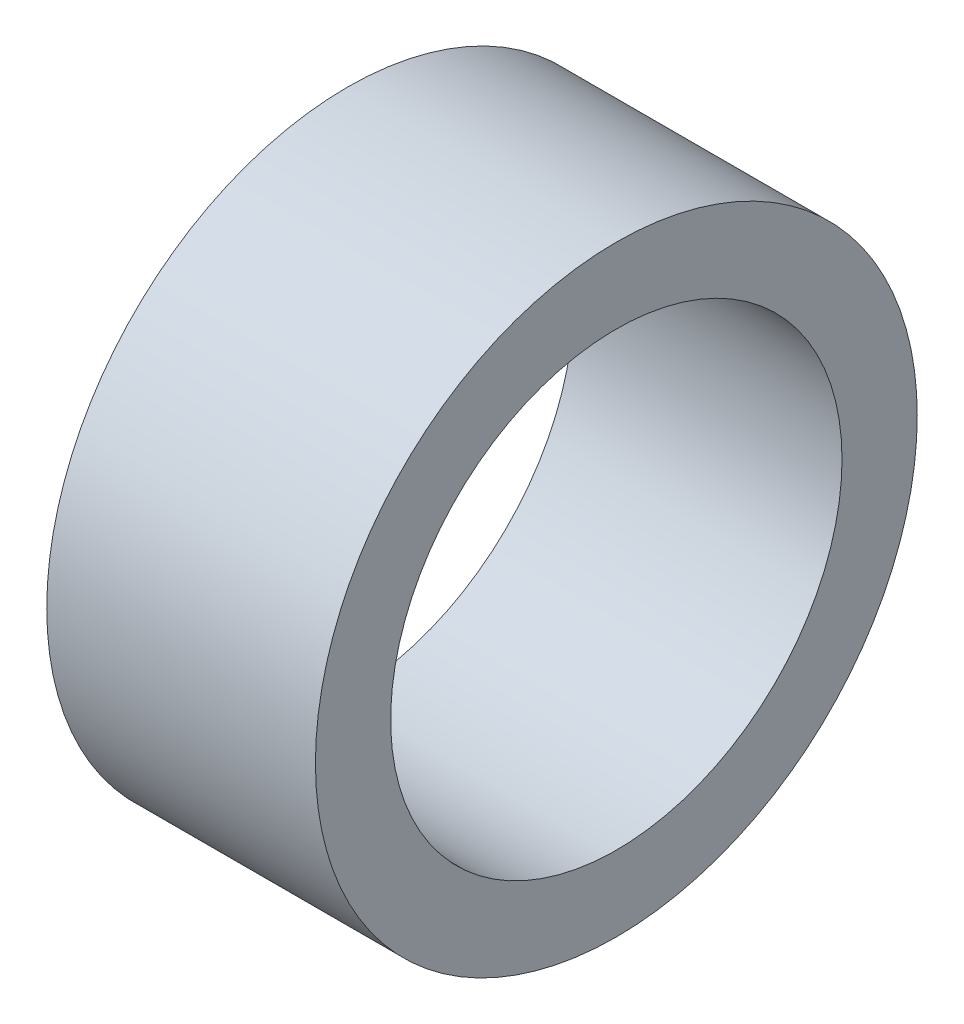
ISO-10303-21;
HEADER;
FILE_DESCRIPTION(('STEP AP214'),'2;1');
FILE_NAME('part.step','',(''),(''),'','','');
FILE_SCHEMA(('AUTOMOTIVE_DESIGN { 1 0 10303 214 1 1 1 1 }'));
ENDSEC;
DATA;
#1=APPLICATION_CONTEXT('core data for automotive mechanical design processes');
#2=APPLICATION_PROTOCOL_DEFINITION('international standard','automotive_design',2000,#1);
#3=PRODUCT_CONTEXT('',#1,'mechanical');
#4=PRODUCT('Part','Part','',(#3));
#5=PRODUCT_RELATED_PRODUCT_CATEGORY('part','',(#4));
#6=PRODUCT_DEFINITION_FORMATION('','',#4);
#7=PRODUCT_DEFINITION_CONTEXT('part definition',#1,'design');
#8=PRODUCT_DEFINITION('design','',#6,#7);
#9=PRODUCT_DEFINITION_SHAPE('','',#8);
#10=(LENGTH_UNIT() NAMED_UNIT(*) SI_UNIT(.MILLI.,.METRE.));
#11=(NAMED_UNIT(*) PLANE_ANGLE_UNIT() SI_UNIT($,.RADIAN.));
#12=(NAMED_UNIT(*) SI_UNIT($,.STERADIAN.) SOLID_ANGLE_UNIT());
#13=UNCERTAINTY_MEASURE_WITH_UNIT(LENGTH_MEASURE(1.E-05),#10,'distance_accuracy_value','');
#14=(GEOMETRIC_REPRESENTATION_CONTEXT(3) GLOBAL_UNCERTAINTY_ASSIGNED_CONTEXT((#13)) GLOBAL_UNIT_ASSIGNED_CONTEXT((#10,
#11,#12)) REPRESENTATION_CONTEXT('',''));
#15=CARTESIAN_POINT('',(0.,0.,0.));
#16=DIRECTION('',(0.,0.,1.));
#17=DIRECTION('',(1.,0.,0.));
#18=AXIS2_PLACEMENT_3D('',#15,#16,#17);
#19=CARTESIAN_POINT('',(1.25,0.,0.));
#20=DIRECTION('',(1.,0.,0.));
#21=DIRECTION('',(0.,0.,-1.));
#22=AXIS2_PLACEMENT_3D('',#19,#20,#21);
#23=PLANE('',#22);
#24=CARTESIAN_POINT('',(1.25,0.,0.));
#25=DIRECTION('',(1.,0.,0.));
#26=DIRECTION('',(0.,0.,-1.));
#27=AXIS2_PLACEMENT_3D('',#24,#25,#26);
#28=CIRCLE('',#27,2.8);
#29=CARTESIAN_POINT('',(1.25,0.,-2.8));
#30=VERTEX_POINT('',#29);
#31=EDGE_CURVE('E10',#30,#30,#28,.T.);
#32=ORIENTED_EDGE('',*,*,#31,.T.);
#33=EDGE_LOOP('',(#32));
#34=FACE_BOUND('',#33,.T.);
#35=CARTESIAN_POINT('',(1.25,0.,0.));
#36=DIRECTION('',(1.,0.,0.));
#37=DIRECTION('',(0.,0.,-1.));
#38=AXIS2_PLACEMENT_3D('',#35,#36,#37);
#39=CIRCLE('',#38,2.1);
#40=CARTESIAN_POINT('',(1.25,0.,-2.1));
#41=VERTEX_POINT('',#40);
#42=EDGE_CURVE('E41',#41,#41,#39,.T.);
#43=ORIENTED_EDGE('',*,*,#42,.F.);
#44=EDGE_LOOP('',(#43));
#45=FACE_BOUND('',#44,.T.);
#46=ADVANCED_FACE('F30',(#34,#45),#23,.T.);
#47=CARTESIAN_POINT('',(-1.25,0.,0.));
#48=DIRECTION('',(1.,0.,0.));
#49=DIRECTION('',(0.,0.,-1.));
#50=AXIS2_PLACEMENT_3D('',#47,#48,#49);
#51=PLANE('',#50);
#52=CARTESIAN_POINT('',(-1.25,0.,0.));
#53=DIRECTION('',(1.,0.,0.));
#54=DIRECTION('',(0.,0.,-1.));
#55=AXIS2_PLACEMENT_3D('',#52,#53,#54);
#56=CIRCLE('',#55,2.8);
#57=CARTESIAN_POINT('',(-1.25,0.,-2.8));
#58=VERTEX_POINT('',#57);
#59=EDGE_CURVE('E34',#58,#58,#56,.T.);
#60=ORIENTED_EDGE('',*,*,#59,.F.);
#61=EDGE_LOOP('',(#60));
#62=FACE_BOUND('',#61,.T.);
#63=CARTESIAN_POINT('',(-1.25,0.,0.));
#64=DIRECTION('',(1.,0.,0.));
#65=DIRECTION('',(0.,0.,-1.));
#66=AXIS2_PLACEMENT_3D('',#63,#64,#65);
#67=CIRCLE('',#66,2.1);
#68=CARTESIAN_POINT('',(-1.25,0.,-2.1));
#69=VERTEX_POINT('',#68);
#70=EDGE_CURVE('E43',#69,#69,#67,.T.);
#71=ORIENTED_EDGE('',*,*,#70,.T.);
#72=EDGE_LOOP('',(#71));
#73=FACE_BOUND('',#72,.T.);
#74=ADVANCED_FACE('F53',(#62,#73),#51,.F.);
#75=CARTESIAN_POINT('',(1.25,0.,0.));
#76=DIRECTION('',(-1.,0.,0.));
#77=DIRECTION('',(0.,0.,1.));
#78=AXIS2_PLACEMENT_3D('',#75,#76,#77);
#79=CYLINDRICAL_SURFACE('',#78,2.8);
#80=ORIENTED_EDGE('',*,*,#31,.F.);
#81=EDGE_LOOP('',(#80));
#82=FACE_BOUND('',#81,.T.);
#83=ORIENTED_EDGE('',*,*,#59,.T.);
#84=EDGE_LOOP('',(#83));
#85=FACE_BOUND('',#84,.T.);
#86=ADVANCED_FACE('F32',(#82,#85),#79,.T.);
#87=CARTESIAN_POINT('',(1.25,0.,0.));
#88=DIRECTION('',(-1.,0.,0.));
#89=DIRECTION('',(0.,0.,1.));
#90=AXIS2_PLACEMENT_3D('',#87,#88,#89);
#91=CYLINDRICAL_SURFACE('',#90,2.1);
#92=ORIENTED_EDGE('',*,*,#42,.T.);
#93=EDGE_LOOP('',(#92));
#94=FACE_BOUND('',#93,.T.);
#95=ORIENTED_EDGE('',*,*,#70,.F.);
#96=EDGE_LOOP('',(#95));
#97=FACE_BOUND('',#96,.T.);
#98=ADVANCED_FACE('F49',(#94,#97),#91,.F.);
#99=CLOSED_SHELL('',(#46,#74,#86,#98));
#100=MANIFOLD_SOLID_BREP('B2',#99);
#101=ADVANCED_BREP_SHAPE_REPRESENTATION('',(#18,#100),#14);
#102=SHAPE_DEFINITION_REPRESENTATION(#9,#101);
ENDSEC;
END-ISO-10303-21;
